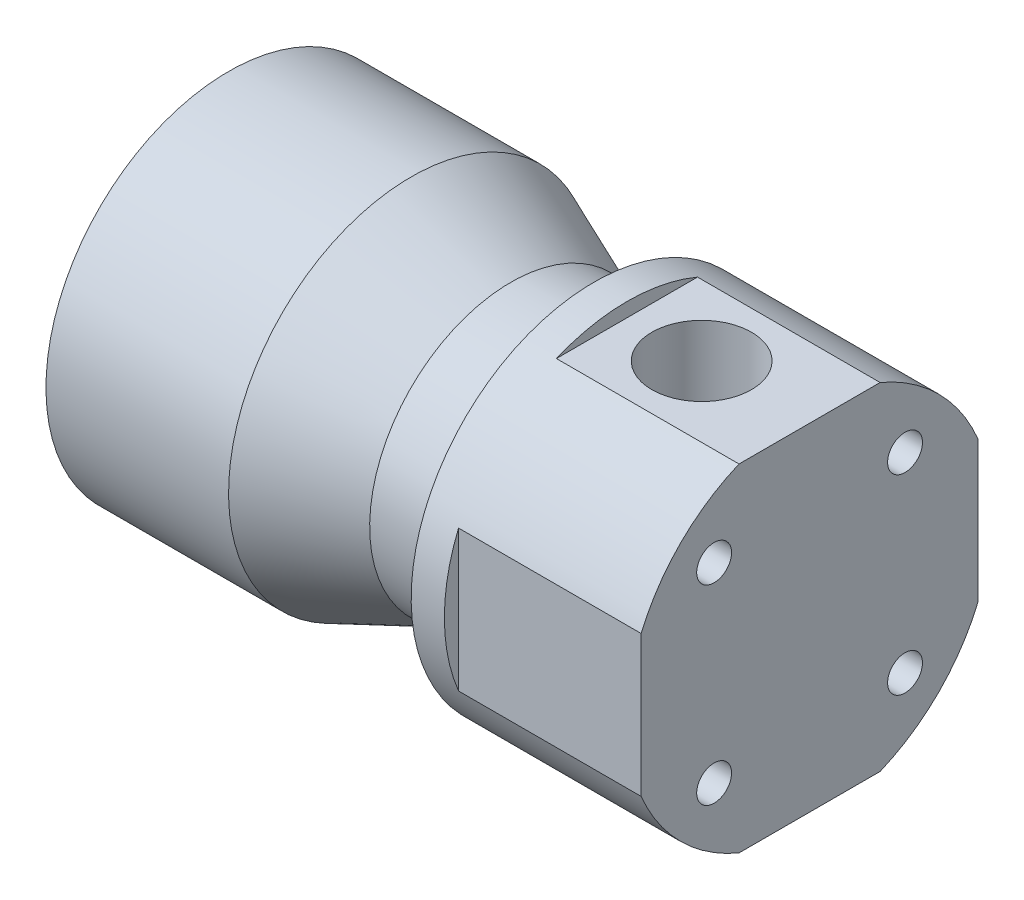
ISO-10303-21;
HEADER;
FILE_DESCRIPTION(('STEP AP214'),'2;1');
FILE_NAME('part.step','',(''),(''),'','','');
FILE_SCHEMA(('AUTOMOTIVE_DESIGN { 1 0 10303 214 1 1 1 1 }'));
ENDSEC;
DATA;
#1=APPLICATION_CONTEXT('core data for automotive mechanical design processes');
#2=APPLICATION_PROTOCOL_DEFINITION('international standard','automotive_design',2000,#1);
#3=PRODUCT_CONTEXT('',#1,'mechanical');
#4=PRODUCT('Part','Part','',(#3));
#5=PRODUCT_RELATED_PRODUCT_CATEGORY('part','',(#4));
#6=PRODUCT_DEFINITION_FORMATION('','',#4);
#7=PRODUCT_DEFINITION_CONTEXT('part definition',#1,'design');
#8=PRODUCT_DEFINITION('design','',#6,#7);
#9=PRODUCT_DEFINITION_SHAPE('','',#8);
#10=(LENGTH_UNIT() NAMED_UNIT(*) SI_UNIT(.MILLI.,.METRE.));
#11=(NAMED_UNIT(*) PLANE_ANGLE_UNIT() SI_UNIT($,.RADIAN.));
#12=(NAMED_UNIT(*) SI_UNIT($,.STERADIAN.) SOLID_ANGLE_UNIT());
#13=UNCERTAINTY_MEASURE_WITH_UNIT(LENGTH_MEASURE(1.E-05),#10,'distance_accuracy_value','');
#14=(GEOMETRIC_REPRESENTATION_CONTEXT(3) GLOBAL_UNCERTAINTY_ASSIGNED_CONTEXT((#13)) GLOBAL_UNIT_ASSIGNED_CONTEXT((#10,
#11,#12)) REPRESENTATION_CONTEXT('',''));
#15=CARTESIAN_POINT('',(0.,0.,0.));
#16=DIRECTION('',(0.,0.,1.));
#17=DIRECTION('',(1.,0.,0.));
#18=AXIS2_PLACEMENT_3D('',#15,#16,#17);
#19=CARTESIAN_POINT('',(0.,0.,0.));
#20=DIRECTION('',(-1.,0.,0.));
#21=DIRECTION('',(0.,-1.,0.));
#22=AXIS2_PLACEMENT_3D('',#19,#20,#21);
#23=PLANE('',#22);
#24=CARTESIAN_POINT('',(0.,11.5,11.5));
#25=DIRECTION('',(1.,0.,0.));
#26=DIRECTION('',(0.,0.,-1.));
#27=AXIS2_PLACEMENT_3D('',#24,#25,#26);
#28=CIRCLE('',#27,2.1);
#29=CARTESIAN_POINT('',(0.,11.5,9.4));
#30=VERTEX_POINT('',#29);
#31=EDGE_CURVE('E192',#30,#30,#28,.T.);
#32=ORIENTED_EDGE('',*,*,#31,.F.);
#33=EDGE_LOOP('',(#32));
#34=FACE_BOUND('',#33,.T.);
#35=CARTESIAN_POINT('',(0.,11.5,-11.5));
#36=DIRECTION('',(1.,0.,0.));
#37=DIRECTION('',(0.,0.,-1.));
#38=AXIS2_PLACEMENT_3D('',#35,#36,#37);
#39=CIRCLE('',#38,2.1);
#40=CARTESIAN_POINT('',(0.,11.5,-13.6));
#41=VERTEX_POINT('',#40);
#42=EDGE_CURVE('E184',#41,#41,#39,.T.);
#43=ORIENTED_EDGE('',*,*,#42,.F.);
#44=EDGE_LOOP('',(#43));
#45=FACE_BOUND('',#44,.T.);
#46=CARTESIAN_POINT('',(0.,-11.5,-11.5));
#47=DIRECTION('',(1.,0.,0.));
#48=DIRECTION('',(0.,0.,-1.));
#49=AXIS2_PLACEMENT_3D('',#46,#47,#48);
#50=CIRCLE('',#49,2.1);
#51=CARTESIAN_POINT('',(0.,-11.5,-13.6));
#52=VERTEX_POINT('',#51);
#53=EDGE_CURVE('E176',#52,#52,#50,.T.);
#54=ORIENTED_EDGE('',*,*,#53,.F.);
#55=EDGE_LOOP('',(#54));
#56=FACE_BOUND('',#55,.T.);
#57=CARTESIAN_POINT('',(0.,-11.5,11.5));
#58=DIRECTION('',(1.,0.,0.));
#59=DIRECTION('',(0.,0.,-1.));
#60=AXIS2_PLACEMENT_3D('',#57,#58,#59);
#61=CIRCLE('',#60,2.1);
#62=CARTESIAN_POINT('',(0.,-11.5,9.4));
#63=VERTEX_POINT('',#62);
#64=EDGE_CURVE('E165',#63,#63,#61,.T.);
#65=ORIENTED_EDGE('',*,*,#64,.F.);
#66=EDGE_LOOP('',(#65));
#67=FACE_BOUND('',#66,.T.);
#68=CARTESIAN_POINT('',(0.,0.,0.));
#69=DIRECTION('',(-1.,0.,0.));
#70=DIRECTION('',(0.,-1.,0.));
#71=AXIS2_PLACEMENT_3D('',#68,#69,#70);
#72=CIRCLE('',#71,22.);
#73=CARTESIAN_POINT('',(0.,8.5,20.291623887703));
#74=VERTEX_POINT('',#73);
#75=CARTESIAN_POINT('',(0.,20.2916238877031,8.49999999999993));
#76=VERTEX_POINT('',#75);
#77=EDGE_CURVE('E53',#74,#76,#72,.T.);
#78=ORIENTED_EDGE('',*,*,#77,.F.);
#79=DIRECTION('',(0.,1.,0.));
#80=VECTOR('',#79,1.);
#81=CARTESIAN_POINT('',(0.,-8.5,20.291623887703));
#82=LINE('',#81,#80);
#83=CARTESIAN_POINT('',(0.,-8.5,20.291623887703));
#84=VERTEX_POINT('',#83);
#85=EDGE_CURVE('E169',#84,#74,#82,.T.);
#86=ORIENTED_EDGE('',*,*,#85,.F.);
#87=CARTESIAN_POINT('',(0.,-20.2916238877029,8.50000000000021));
#88=VERTEX_POINT('',#87);
#89=EDGE_CURVE('E11',#88,#84,#72,.T.);
#90=ORIENTED_EDGE('',*,*,#89,.F.);
#91=DIRECTION('',(0.,0.,1.));
#92=VECTOR('',#91,1.);
#93=CARTESIAN_POINT('',(0.,-20.2916238877031,-8.49999999999979));
#94=LINE('',#93,#92);
#95=CARTESIAN_POINT('',(0.,-20.2916238877031,-8.49999999999979));
#96=VERTEX_POINT('',#95);
#97=EDGE_CURVE('E213',#96,#88,#94,.T.);
#98=ORIENTED_EDGE('',*,*,#97,.F.);
#99=CARTESIAN_POINT('',(0.,-8.50000000000014,-20.291623887703));
#100=VERTEX_POINT('',#99);
#101=EDGE_CURVE('E54',#100,#96,#72,.T.);
#102=ORIENTED_EDGE('',*,*,#101,.F.);
#103=DIRECTION('',(0.,-1.,0.));
#104=VECTOR('',#103,1.);
#105=CARTESIAN_POINT('',(0.,8.49999999999986,-20.2916238877031));
#106=LINE('',#105,#104);
#107=CARTESIAN_POINT('',(0.,8.49999999999986,-20.2916238877031));
#108=VERTEX_POINT('',#107);
#109=EDGE_CURVE('E132',#108,#100,#106,.T.);
#110=ORIENTED_EDGE('',*,*,#109,.F.);
#111=CARTESIAN_POINT('',(0.,20.291623887703,-8.50000000000007));
#112=VERTEX_POINT('',#111);
#113=EDGE_CURVE('E130',#112,#108,#72,.T.);
#114=ORIENTED_EDGE('',*,*,#113,.F.);
#115=DIRECTION('',(0.,0.,-1.));
#116=VECTOR('',#115,1.);
#117=CARTESIAN_POINT('',(0.,20.2916238877031,8.49999999999993));
#118=LINE('',#117,#116);
#119=EDGE_CURVE('E110',#76,#112,#118,.T.);
#120=ORIENTED_EDGE('',*,*,#119,.F.);
#121=EDGE_LOOP('',(#78,#86,#90,#98,#102,#110,#114,#120));
#122=FACE_BOUND('',#121,.T.);
#123=ADVANCED_FACE('F45',(#34,#45,#56,#67,#122),#23,.F.);
#124=CARTESIAN_POINT('',(-70.,0.,0.));
#125=DIRECTION('',(-1.,0.,0.));
#126=DIRECTION('',(0.,-1.,0.));
#127=AXIS2_PLACEMENT_3D('',#124,#125,#126);
#128=CYLINDRICAL_SURFACE('',#127,22.);
#129=ORIENTED_EDGE('',*,*,#89,.T.);
#130=DIRECTION('',(1.,0.,0.));
#131=VECTOR('',#130,1.);
#132=CARTESIAN_POINT('',(-22.,-8.5,20.291623887703));
#133=LINE('',#132,#131);
#134=CARTESIAN_POINT('',(-22.,-8.5,20.291623887703));
#135=VERTEX_POINT('',#134);
#136=EDGE_CURVE('E202',#135,#84,#133,.T.);
#137=ORIENTED_EDGE('',*,*,#136,.F.);
#138=CARTESIAN_POINT('',(-22.,0.,0.));
#139=DIRECTION('',(1.,0.,0.));
#140=DIRECTION('',(0.,0.,-1.));
#141=AXIS2_PLACEMENT_3D('',#138,#139,#140);
#142=CIRCLE('',#141,22.);
#143=CARTESIAN_POINT('',(-22.,8.5,20.291623887703));
#144=VERTEX_POINT('',#143);
#145=EDGE_CURVE('E197',#144,#135,#142,.T.);
#146=ORIENTED_EDGE('',*,*,#145,.F.);
#147=DIRECTION('',(1.,0.,0.));
#148=VECTOR('',#147,1.);
#149=CARTESIAN_POINT('',(-22.,8.5,20.291623887703));
#150=LINE('',#149,#148);
#151=EDGE_CURVE('E196',#144,#74,#150,.T.);
#152=ORIENTED_EDGE('',*,*,#151,.T.);
#153=ORIENTED_EDGE('',*,*,#77,.T.);
#154=DIRECTION('',(1.,0.,0.));
#155=VECTOR('',#154,1.);
#156=CARTESIAN_POINT('',(-22.,20.2916238877031,8.49999999999993));
#157=LINE('',#156,#155);
#158=CARTESIAN_POINT('',(-22.,20.2916238877031,8.49999999999993));
#159=VERTEX_POINT('',#158);
#160=EDGE_CURVE('E116',#159,#76,#157,.T.);
#161=ORIENTED_EDGE('',*,*,#160,.F.);
#162=CARTESIAN_POINT('',(-22.,0.,0.));
#163=DIRECTION('',(1.,0.,0.));
#164=DIRECTION('',(0.,0.,-1.));
#165=AXIS2_PLACEMENT_3D('',#162,#163,#164);
#166=CIRCLE('',#165,22.);
#167=CARTESIAN_POINT('',(-22.,20.291623887703,-8.50000000000007));
#168=VERTEX_POINT('',#167);
#169=EDGE_CURVE('E123',#168,#159,#166,.T.);
#170=ORIENTED_EDGE('',*,*,#169,.F.);
#171=DIRECTION('',(1.,0.,0.));
#172=VECTOR('',#171,1.);
#173=CARTESIAN_POINT('',(-22.,20.291623887703,-8.50000000000007));
#174=LINE('',#173,#172);
#175=EDGE_CURVE('E113',#168,#112,#174,.T.);
#176=ORIENTED_EDGE('',*,*,#175,.T.);
#177=ORIENTED_EDGE('',*,*,#113,.T.);
#178=DIRECTION('',(1.,0.,0.));
#179=VECTOR('',#178,1.);
#180=CARTESIAN_POINT('',(-22.,8.49999999999986,-20.2916238877031));
#181=LINE('',#180,#179);
#182=CARTESIAN_POINT('',(-22.,8.49999999999986,-20.2916238877031));
#183=VERTEX_POINT('',#182);
#184=EDGE_CURVE('E234',#183,#108,#181,.T.);
#185=ORIENTED_EDGE('',*,*,#184,.F.);
#186=CARTESIAN_POINT('',(-22.,0.,0.));
#187=DIRECTION('',(1.,0.,0.));
#188=DIRECTION('',(0.,0.,-1.));
#189=AXIS2_PLACEMENT_3D('',#186,#187,#188);
#190=CIRCLE('',#189,22.);
#191=CARTESIAN_POINT('',(-22.,-8.50000000000014,-20.291623887703));
#192=VERTEX_POINT('',#191);
#193=EDGE_CURVE('E228',#192,#183,#190,.T.);
#194=ORIENTED_EDGE('',*,*,#193,.F.);
#195=DIRECTION('',(1.,0.,0.));
#196=VECTOR('',#195,1.);
#197=CARTESIAN_POINT('',(-22.,-8.50000000000014,-20.291623887703));
#198=LINE('',#197,#196);
#199=EDGE_CURVE('E220',#192,#100,#198,.T.);
#200=ORIENTED_EDGE('',*,*,#199,.T.);
#201=ORIENTED_EDGE('',*,*,#101,.T.);
#202=DIRECTION('',(1.,0.,0.));
#203=VECTOR('',#202,1.);
#204=CARTESIAN_POINT('',(-22.,-20.2916238877031,-8.49999999999979));
#205=LINE('',#204,#203);
#206=CARTESIAN_POINT('',(-22.,-20.2916238877031,-8.49999999999979));
#207=VERTEX_POINT('',#206);
#208=EDGE_CURVE('E217',#207,#96,#205,.T.);
#209=ORIENTED_EDGE('',*,*,#208,.F.);
#210=CARTESIAN_POINT('',(-22.,0.,0.));
#211=DIRECTION('',(1.,0.,0.));
#212=DIRECTION('',(0.,0.,-1.));
#213=AXIS2_PLACEMENT_3D('',#210,#211,#212);
#214=CIRCLE('',#213,22.);
#215=CARTESIAN_POINT('',(-22.,-20.2916238877029,8.50000000000021));
#216=VERTEX_POINT('',#215);
#217=EDGE_CURVE('E210',#216,#207,#214,.T.);
#218=ORIENTED_EDGE('',*,*,#217,.F.);
#219=DIRECTION('',(1.,0.,0.));
#220=VECTOR('',#219,1.);
#221=CARTESIAN_POINT('',(-22.,-20.2916238877029,8.50000000000021));
#222=LINE('',#221,#220);
#223=EDGE_CURVE('E221',#216,#88,#222,.T.);
#224=ORIENTED_EDGE('',*,*,#223,.T.);
#225=EDGE_LOOP('',(#129,#137,#146,#152,#153,#161,#170,#176,#177,#185,#194,#200,#201,#209,#218,#224));
#226=FACE_BOUND('',#225,.T.);
#227=CARTESIAN_POINT('',(-26.,0.,0.));
#228=DIRECTION('',(-1.,0.,0.));
#229=DIRECTION('',(0.,-1.,0.));
#230=AXIS2_PLACEMENT_3D('',#227,#228,#229);
#231=CIRCLE('',#230,22.);
#232=CARTESIAN_POINT('',(-26.,-22.,0.));
#233=VERTEX_POINT('',#232);
#234=EDGE_CURVE('E140',#233,#233,#231,.T.);
#235=ORIENTED_EDGE('',*,*,#234,.F.);
#236=EDGE_LOOP('',(#235));
#237=FACE_BOUND('',#236,.T.);
#238=ADVANCED_FACE('F127',(#226,#237),#128,.T.);
#239=CARTESIAN_POINT('',(-26.,22.,0.));
#240=DIRECTION('',(1.,0.,0.));
#241=DIRECTION('',(0.,1.,0.));
#242=AXIS2_PLACEMENT_3D('',#239,#240,#241);
#243=PLANE('',#242);
#244=CARTESIAN_POINT('',(-26.,0.,0.));
#245=DIRECTION('',(-1.,0.,0.));
#246=DIRECTION('',(0.,-1.,0.));
#247=AXIS2_PLACEMENT_3D('',#244,#245,#246);
#248=CIRCLE('',#247,17.);
#249=CARTESIAN_POINT('',(-26.,-17.,0.));
#250=VERTEX_POINT('',#249);
#251=EDGE_CURVE('E145',#250,#250,#248,.T.);
#252=ORIENTED_EDGE('',*,*,#251,.F.);
#253=EDGE_LOOP('',(#252));
#254=FACE_BOUND('',#253,.T.);
#255=ORIENTED_EDGE('',*,*,#234,.T.);
#256=EDGE_LOOP('',(#255));
#257=FACE_BOUND('',#256,.T.);
#258=ADVANCED_FACE('F280',(#254,#257),#243,.F.);
#259=CARTESIAN_POINT('',(-70.,0.,0.));
#260=DIRECTION('',(-1.,0.,0.));
#261=DIRECTION('',(0.,-1.,0.));
#262=AXIS2_PLACEMENT_3D('',#259,#260,#261);
#263=CYLINDRICAL_SURFACE('',#262,17.);
#264=CARTESIAN_POINT('',(-36.,0.,0.));
#265=DIRECTION('',(-1.,0.,0.));
#266=DIRECTION('',(0.,-1.,0.));
#267=AXIS2_PLACEMENT_3D('',#264,#265,#266);
#268=CIRCLE('',#267,17.);
#269=CARTESIAN_POINT('',(-36.,-17.,0.));
#270=VERTEX_POINT('',#269);
#271=EDGE_CURVE('E150',#270,#270,#268,.T.);
#272=ORIENTED_EDGE('',*,*,#271,.F.);
#273=EDGE_LOOP('',(#272));
#274=FACE_BOUND('',#273,.T.);
#275=ORIENTED_EDGE('',*,*,#251,.T.);
#276=EDGE_LOOP('',(#275));
#277=FACE_BOUND('',#276,.T.);
#278=ADVANCED_FACE('F317',(#274,#277),#263,.T.);
#279=CARTESIAN_POINT('',(-36.,0.,0.));
#280=DIRECTION('',(-1.,0.,0.));
#281=DIRECTION('',(0.,-1.,0.));
#282=AXIS2_PLACEMENT_3D('',#279,#280,#281);
#283=CONICAL_SURFACE('',#282,17.,0.394791119699761);
#284=CARTESIAN_POINT('',(-48.,0.,0.));
#285=DIRECTION('',(-1.,0.,0.));
#286=DIRECTION('',(0.,-1.,0.));
#287=AXIS2_PLACEMENT_3D('',#284,#285,#286);
#288=CIRCLE('',#287,22.);
#289=CARTESIAN_POINT('',(-48.,-22.,0.));
#290=VERTEX_POINT('',#289);
#291=EDGE_CURVE('E156',#290,#290,#288,.T.);
#292=ORIENTED_EDGE('',*,*,#291,.F.);
#293=EDGE_LOOP('',(#292));
#294=FACE_BOUND('',#293,.T.);
#295=ORIENTED_EDGE('',*,*,#271,.T.);
#296=EDGE_LOOP('',(#295));
#297=FACE_BOUND('',#296,.T.);
#298=ADVANCED_FACE('F313',(#294,#297),#283,.T.);
#299=CARTESIAN_POINT('',(-70.,0.,0.));
#300=DIRECTION('',(-1.,0.,0.));
#301=DIRECTION('',(0.,-1.,0.));
#302=AXIS2_PLACEMENT_3D('',#299,#300,#301);
#303=CYLINDRICAL_SURFACE('',#302,22.);
#304=CARTESIAN_POINT('',(-70.,0.,0.));
#305=DIRECTION('',(-1.,0.,0.));
#306=DIRECTION('',(0.,-1.,0.));
#307=AXIS2_PLACEMENT_3D('',#304,#305,#306);
#308=CIRCLE('',#307,22.);
#309=CARTESIAN_POINT('',(-70.,-22.,0.));
#310=VERTEX_POINT('',#309);
#311=EDGE_CURVE('E160',#310,#310,#308,.T.);
#312=ORIENTED_EDGE('',*,*,#311,.F.);
#313=EDGE_LOOP('',(#312));
#314=FACE_BOUND('',#313,.T.);
#315=ORIENTED_EDGE('',*,*,#291,.T.);
#316=EDGE_LOOP('',(#315));
#317=FACE_BOUND('',#316,.T.);
#318=ADVANCED_FACE('F309',(#314,#317),#303,.T.);
#319=CARTESIAN_POINT('',(-70.,22.,0.));
#320=DIRECTION('',(1.,0.,0.));
#321=DIRECTION('',(0.,1.,0.));
#322=AXIS2_PLACEMENT_3D('',#319,#320,#321);
#323=PLANE('',#322);
#324=ORIENTED_EDGE('',*,*,#311,.T.);
#325=EDGE_LOOP('',(#324));
#326=FACE_BOUND('',#325,.T.);
#327=ADVANCED_FACE('F306',(#326),#323,.F.);
#328=CARTESIAN_POINT('',(-22.,-20.2916238877031,-8.49999999999979));
#329=DIRECTION('',(0.,1.,0.));
#330=DIRECTION('',(0.,0.,1.));
#331=AXIS2_PLACEMENT_3D('',#328,#329,#330);
#332=PLANE('',#331);
#333=CARTESIAN_POINT('',(-13.,-20.291623887703,0.));
#334=DIRECTION('',(0.,1.,0.));
#335=DIRECTION('',(0.,0.,1.));
#336=AXIS2_PLACEMENT_3D('',#333,#334,#335);
#337=CIRCLE('',#336,6.);
#338=CARTESIAN_POINT('',(-13.,-20.291623887703,6.00000000000008));
#339=VERTEX_POINT('',#338);
#340=EDGE_CURVE('E225',#339,#339,#337,.F.);
#341=ORIENTED_EDGE('',*,*,#340,.F.);
#342=EDGE_LOOP('',(#341));
#343=FACE_BOUND('',#342,.T.);
#344=ORIENTED_EDGE('',*,*,#97,.T.);
#345=ORIENTED_EDGE('',*,*,#223,.F.);
#346=DIRECTION('',(0.,0.,1.));
#347=VECTOR('',#346,1.);
#348=CARTESIAN_POINT('',(-22.,-20.2916238877031,-8.49999999999979));
#349=LINE('',#348,#347);
#350=EDGE_CURVE('E214',#207,#216,#349,.T.);
#351=ORIENTED_EDGE('',*,*,#350,.F.);
#352=ORIENTED_EDGE('',*,*,#208,.T.);
#353=EDGE_LOOP('',(#344,#345,#351,#352));
#354=FACE_BOUND('',#353,.T.);
#355=ADVANCED_FACE('F308',(#343,#354),#332,.F.);
#356=CARTESIAN_POINT('',(-22.,0.,0.));
#357=DIRECTION('',(1.,0.,0.));
#358=DIRECTION('',(0.,0.,-1.));
#359=AXIS2_PLACEMENT_3D('',#356,#357,#358);
#360=PLANE('',#359);
#361=ORIENTED_EDGE('',*,*,#217,.T.);
#362=ORIENTED_EDGE('',*,*,#350,.T.);
#363=EDGE_LOOP('',(#361,#362));
#364=FACE_BOUND('',#363,.T.);
#365=ADVANCED_FACE('F358',(#364),#360,.T.);
#366=CARTESIAN_POINT('',(-22.,8.49999999999986,-20.2916238877031));
#367=DIRECTION('',(0.,0.,1.));
#368=DIRECTION('',(0.,-1.,0.));
#369=AXIS2_PLACEMENT_3D('',#366,#367,#368);
#370=PLANE('',#369);
#371=ORIENTED_EDGE('',*,*,#109,.T.);
#372=ORIENTED_EDGE('',*,*,#199,.F.);
#373=DIRECTION('',(0.,-1.,0.));
#374=VECTOR('',#373,1.);
#375=CARTESIAN_POINT('',(-22.,8.49999999999986,-20.2916238877031));
#376=LINE('',#375,#374);
#377=EDGE_CURVE('E231',#183,#192,#376,.T.);
#378=ORIENTED_EDGE('',*,*,#377,.F.);
#379=ORIENTED_EDGE('',*,*,#184,.T.);
#380=EDGE_LOOP('',(#371,#372,#378,#379));
#381=FACE_BOUND('',#380,.T.);
#382=ADVANCED_FACE('F270',(#381),#370,.F.);
#383=CARTESIAN_POINT('',(-22.,0.,0.));
#384=DIRECTION('',(1.,0.,0.));
#385=DIRECTION('',(0.,0.,-1.));
#386=AXIS2_PLACEMENT_3D('',#383,#384,#385);
#387=PLANE('',#386);
#388=ORIENTED_EDGE('',*,*,#193,.T.);
#389=ORIENTED_EDGE('',*,*,#377,.T.);
#390=EDGE_LOOP('',(#388,#389));
#391=FACE_BOUND('',#390,.T.);
#392=ADVANCED_FACE('F260',(#391),#387,.T.);
#393=CARTESIAN_POINT('',(-22.,20.2916238877031,8.49999999999993));
#394=DIRECTION('',(0.,-1.,0.));
#395=DIRECTION('',(0.,0.,-1.));
#396=AXIS2_PLACEMENT_3D('',#393,#394,#395);
#397=PLANE('',#396);
#398=CARTESIAN_POINT('',(-13.,20.291623887703,0.));
#399=DIRECTION('',(0.,1.,0.));
#400=DIRECTION('',(0.,0.,1.));
#401=AXIS2_PLACEMENT_3D('',#398,#399,#400);
#402=CIRCLE('',#401,6.);
#403=CARTESIAN_POINT('',(-13.,20.2916238877031,5.99999999999993));
#404=VERTEX_POINT('',#403);
#405=EDGE_CURVE('E250',#404,#404,#402,.T.);
#406=ORIENTED_EDGE('',*,*,#405,.F.);
#407=EDGE_LOOP('',(#406));
#408=FACE_BOUND('',#407,.T.);
#409=ORIENTED_EDGE('',*,*,#119,.T.);
#410=ORIENTED_EDGE('',*,*,#175,.F.);
#411=DIRECTION('',(0.,0.,-1.));
#412=VECTOR('',#411,1.);
#413=CARTESIAN_POINT('',(-22.,20.2916238877031,8.49999999999993));
#414=LINE('',#413,#412);
#415=EDGE_CURVE('E67',#159,#168,#414,.T.);
#416=ORIENTED_EDGE('',*,*,#415,.F.);
#417=ORIENTED_EDGE('',*,*,#160,.T.);
#418=EDGE_LOOP('',(#409,#410,#416,#417));
#419=FACE_BOUND('',#418,.T.);
#420=ADVANCED_FACE('F112',(#408,#419),#397,.F.);
#421=CARTESIAN_POINT('',(-22.,0.,0.));
#422=DIRECTION('',(1.,0.,0.));
#423=DIRECTION('',(0.,0.,-1.));
#424=AXIS2_PLACEMENT_3D('',#421,#422,#423);
#425=PLANE('',#424);
#426=ORIENTED_EDGE('',*,*,#169,.T.);
#427=ORIENTED_EDGE('',*,*,#415,.T.);
#428=EDGE_LOOP('',(#426,#427));
#429=FACE_BOUND('',#428,.T.);
#430=ADVANCED_FACE('F259',(#429),#425,.T.);
#431=CARTESIAN_POINT('',(-22.,-8.5,20.291623887703));
#432=DIRECTION('',(0.,0.,-1.));
#433=DIRECTION('',(-1.,0.,0.));
#434=AXIS2_PLACEMENT_3D('',#431,#432,#433);
#435=PLANE('',#434);
#436=ORIENTED_EDGE('',*,*,#85,.T.);
#437=ORIENTED_EDGE('',*,*,#151,.F.);
#438=DIRECTION('',(0.,1.,0.));
#439=VECTOR('',#438,1.);
#440=CARTESIAN_POINT('',(-22.,-8.5,20.291623887703));
#441=LINE('',#440,#439);
#442=EDGE_CURVE('E60',#135,#144,#441,.T.);
#443=ORIENTED_EDGE('',*,*,#442,.F.);
#444=ORIENTED_EDGE('',*,*,#136,.T.);
#445=EDGE_LOOP('',(#436,#437,#443,#444));
#446=FACE_BOUND('',#445,.T.);
#447=ADVANCED_FACE('F267',(#446),#435,.F.);
#448=CARTESIAN_POINT('',(-22.,0.,0.));
#449=DIRECTION('',(1.,0.,0.));
#450=DIRECTION('',(0.,0.,-1.));
#451=AXIS2_PLACEMENT_3D('',#448,#449,#450);
#452=PLANE('',#451);
#453=ORIENTED_EDGE('',*,*,#145,.T.);
#454=ORIENTED_EDGE('',*,*,#442,.T.);
#455=EDGE_LOOP('',(#453,#454));
#456=FACE_BOUND('',#455,.T.);
#457=ADVANCED_FACE('F292',(#456),#452,.T.);
#458=CARTESIAN_POINT('',(-22.,-11.5,11.5));
#459=DIRECTION('',(1.,0.,0.));
#460=DIRECTION('',(0.,0.,-1.));
#461=AXIS2_PLACEMENT_3D('',#458,#459,#460);
#462=CYLINDRICAL_SURFACE('',#461,2.1);
#463=CARTESIAN_POINT('',(-22.,-11.5,11.5));
#464=DIRECTION('',(1.,0.,0.));
#465=DIRECTION('',(0.,0.,-1.));
#466=AXIS2_PLACEMENT_3D('',#463,#464,#465);
#467=CIRCLE('',#466,2.1);
#468=CARTESIAN_POINT('',(-22.,-11.5,9.4));
#469=VERTEX_POINT('',#468);
#470=EDGE_CURVE('E164',#469,#469,#467,.T.);
#471=ORIENTED_EDGE('',*,*,#470,.F.);
#472=EDGE_LOOP('',(#471));
#473=FACE_BOUND('',#472,.T.);
#474=ORIENTED_EDGE('',*,*,#64,.T.);
#475=EDGE_LOOP('',(#474));
#476=FACE_BOUND('',#475,.T.);
#477=ADVANCED_FACE('F289',(#473,#476),#462,.F.);
#478=CARTESIAN_POINT('',(-22.,-11.5,11.5));
#479=DIRECTION('',(1.,0.,0.));
#480=DIRECTION('',(0.,0.,-1.));
#481=AXIS2_PLACEMENT_3D('',#478,#479,#480);
#482=PLANE('',#481);
#483=ORIENTED_EDGE('',*,*,#470,.T.);
#484=EDGE_LOOP('',(#483));
#485=FACE_BOUND('',#484,.T.);
#486=ADVANCED_FACE('F291',(#485),#482,.T.);
#487=CARTESIAN_POINT('',(-22.,-11.5,-11.5));
#488=DIRECTION('',(1.,0.,0.));
#489=DIRECTION('',(0.,0.,-1.));
#490=AXIS2_PLACEMENT_3D('',#487,#488,#489);
#491=CYLINDRICAL_SURFACE('',#490,2.1);
#492=CARTESIAN_POINT('',(-22.,-11.5,-11.5));
#493=DIRECTION('',(1.,0.,0.));
#494=DIRECTION('',(0.,0.,-1.));
#495=AXIS2_PLACEMENT_3D('',#492,#493,#494);
#496=CIRCLE('',#495,2.1);
#497=CARTESIAN_POINT('',(-22.,-11.5,-13.6));
#498=VERTEX_POINT('',#497);
#499=EDGE_CURVE('E122',#498,#498,#496,.T.);
#500=ORIENTED_EDGE('',*,*,#499,.F.);
#501=EDGE_LOOP('',(#500));
#502=FACE_BOUND('',#501,.T.);
#503=ORIENTED_EDGE('',*,*,#53,.T.);
#504=EDGE_LOOP('',(#503));
#505=FACE_BOUND('',#504,.T.);
#506=ADVANCED_FACE('F299',(#502,#505),#491,.F.);
#507=CARTESIAN_POINT('',(-22.,-11.5,-11.5));
#508=DIRECTION('',(1.,0.,0.));
#509=DIRECTION('',(0.,0.,-1.));
#510=AXIS2_PLACEMENT_3D('',#507,#508,#509);
#511=PLANE('',#510);
#512=ORIENTED_EDGE('',*,*,#499,.T.);
#513=EDGE_LOOP('',(#512));
#514=FACE_BOUND('',#513,.T.);
#515=ADVANCED_FACE('F428',(#514),#511,.T.);
#516=CARTESIAN_POINT('',(-22.,11.5,-11.5));
#517=DIRECTION('',(1.,0.,0.));
#518=DIRECTION('',(0.,0.,-1.));
#519=AXIS2_PLACEMENT_3D('',#516,#517,#518);
#520=CYLINDRICAL_SURFACE('',#519,2.1);
#521=CARTESIAN_POINT('',(-22.,11.5,-11.5));
#522=DIRECTION('',(1.,0.,0.));
#523=DIRECTION('',(0.,0.,-1.));
#524=AXIS2_PLACEMENT_3D('',#521,#522,#523);
#525=CIRCLE('',#524,2.1);
#526=CARTESIAN_POINT('',(-22.,11.5,-13.6));
#527=VERTEX_POINT('',#526);
#528=EDGE_CURVE('E180',#527,#527,#525,.T.);
#529=ORIENTED_EDGE('',*,*,#528,.F.);
#530=EDGE_LOOP('',(#529));
#531=FACE_BOUND('',#530,.T.);
#532=ORIENTED_EDGE('',*,*,#42,.T.);
#533=EDGE_LOOP('',(#532));
#534=FACE_BOUND('',#533,.T.);
#535=ADVANCED_FACE('F438',(#531,#534),#520,.F.);
#536=CARTESIAN_POINT('',(-22.,11.5,-11.5));
#537=DIRECTION('',(1.,0.,0.));
#538=DIRECTION('',(0.,0.,-1.));
#539=AXIS2_PLACEMENT_3D('',#536,#537,#538);
#540=PLANE('',#539);
#541=ORIENTED_EDGE('',*,*,#528,.T.);
#542=EDGE_LOOP('',(#541));
#543=FACE_BOUND('',#542,.T.);
#544=ADVANCED_FACE('F447',(#543),#540,.T.);
#545=CARTESIAN_POINT('',(-22.,11.5,11.5));
#546=DIRECTION('',(1.,0.,0.));
#547=DIRECTION('',(0.,0.,-1.));
#548=AXIS2_PLACEMENT_3D('',#545,#546,#547);
#549=CYLINDRICAL_SURFACE('',#548,2.1);
#550=CARTESIAN_POINT('',(-22.,11.5,11.5));
#551=DIRECTION('',(1.,0.,0.));
#552=DIRECTION('',(0.,0.,-1.));
#553=AXIS2_PLACEMENT_3D('',#550,#551,#552);
#554=CIRCLE('',#553,2.1);
#555=CARTESIAN_POINT('',(-22.,11.5,9.4));
#556=VERTEX_POINT('',#555);
#557=EDGE_CURVE('E188',#556,#556,#554,.T.);
#558=ORIENTED_EDGE('',*,*,#557,.F.);
#559=EDGE_LOOP('',(#558));
#560=FACE_BOUND('',#559,.T.);
#561=ORIENTED_EDGE('',*,*,#31,.T.);
#562=EDGE_LOOP('',(#561));
#563=FACE_BOUND('',#562,.T.);
#564=ADVANCED_FACE('F457',(#560,#563),#549,.F.);
#565=CARTESIAN_POINT('',(-22.,11.5,11.5));
#566=DIRECTION('',(1.,0.,0.));
#567=DIRECTION('',(0.,0.,-1.));
#568=AXIS2_PLACEMENT_3D('',#565,#566,#567);
#569=PLANE('',#568);
#570=ORIENTED_EDGE('',*,*,#557,.T.);
#571=EDGE_LOOP('',(#570));
#572=FACE_BOUND('',#571,.T.);
#573=ADVANCED_FACE('F467',(#572),#569,.T.);
#574=CARTESIAN_POINT('',(-13.,-22.0010000000001,0.));
#575=DIRECTION('',(0.,1.,0.));
#576=DIRECTION('',(0.,0.,1.));
#577=AXIS2_PLACEMENT_3D('',#574,#575,#576);
#578=CYLINDRICAL_SURFACE('',#577,6.);
#579=CARTESIAN_POINT('',(-13.,20.2916238877031,5.99999999999993));
#580=CARTESIAN_POINT('',(-13.,19.8688817233759,5.99999999999993));
#581=CARTESIAN_POINT('',(-13.,19.4461395590488,5.99999999999993));
#582=CARTESIAN_POINT('',(-13.,18.6006552303945,5.99999999999993));
#583=CARTESIAN_POINT('',(-13.,18.1779130660673,5.99999999999993));
#584=CARTESIAN_POINT('',(-13.,17.332428737413,5.99999999999994));
#585=CARTESIAN_POINT('',(-13.,16.9096865730859,5.99999999999994));
#586=CARTESIAN_POINT('',(-13.,16.0642022444316,5.99999999999994));
#587=CARTESIAN_POINT('',(-13.,15.6414600801044,5.99999999999994));
#588=CARTESIAN_POINT('',(-13.,14.7959757514502,5.99999999999995));
#589=CARTESIAN_POINT('',(-13.,14.373233587123,5.99999999999995));
#590=CARTESIAN_POINT('',(-13.,13.5277492584687,5.99999999999995));
#591=CARTESIAN_POINT('',(-13.,13.1050070941416,5.99999999999995));
#592=CARTESIAN_POINT('',(-13.,12.2595227654873,5.99999999999996));
#593=CARTESIAN_POINT('',(-13.,11.8367806011601,5.99999999999996));
#594=CARTESIAN_POINT('',(-13.,10.9912962725058,5.99999999999996));
#595=CARTESIAN_POINT('',(-13.,10.5685541081787,5.99999999999996));
#596=CARTESIAN_POINT('',(-13.,9.7230697795244,5.99999999999997));
#597=CARTESIAN_POINT('',(-13.,9.30032761519726,5.99999999999997));
#598=CARTESIAN_POINT('',(-13.,8.45484328654297,5.99999999999997));
#599=CARTESIAN_POINT('',(-13.,8.03210112221582,5.99999999999997));
#600=CARTESIAN_POINT('',(-13.,7.18661679356153,5.99999999999998));
#601=CARTESIAN_POINT('',(-13.,6.76387462923438,5.99999999999998));
#602=CARTESIAN_POINT('',(-13.,5.91839030058009,5.99999999999998));
#603=CARTESIAN_POINT('',(-13.,5.49564813625295,5.99999999999998));
#604=CARTESIAN_POINT('',(-13.,4.65016380759865,5.99999999999998));
#605=CARTESIAN_POINT('',(-13.,4.22742164327151,5.99999999999999));
#606=CARTESIAN_POINT('',(-13.,3.38193731461721,5.99999999999999));
#607=CARTESIAN_POINT('',(-13.,2.95919515029007,5.99999999999999));
#608=CARTESIAN_POINT('',(-13.,2.11371082163577,5.99999999999999));
#609=CARTESIAN_POINT('',(-13.,1.69096865730863,5.99999999999999));
#610=CARTESIAN_POINT('',(-13.,0.845484328654337,6.));
#611=CARTESIAN_POINT('',(-13.,0.422742164327191,6.));
#612=CARTESIAN_POINT('',(-13.,-0.422742164327101,6.));
#613=CARTESIAN_POINT('',(-13.,-0.845484328654247,6.));
#614=CARTESIAN_POINT('',(-13.,-1.69096865730854,6.00000000000001));
#615=CARTESIAN_POINT('',(-13.,-2.11371082163568,6.00000000000001));
#616=CARTESIAN_POINT('',(-13.,-2.95919515028998,6.00000000000001));
#617=CARTESIAN_POINT('',(-13.,-3.38193731461712,6.00000000000001));
#618=CARTESIAN_POINT('',(-13.,-4.22742164327142,6.00000000000002));
#619=CARTESIAN_POINT('',(-13.,-4.65016380759856,6.00000000000002));
#620=CARTESIAN_POINT('',(-13.,-5.49564813625286,6.00000000000002));
#621=CARTESIAN_POINT('',(-13.,-5.91839030058,6.00000000000002));
#622=CARTESIAN_POINT('',(-13.,-6.76387462923429,6.00000000000003));
#623=CARTESIAN_POINT('',(-13.,-7.18661679356144,6.00000000000003));
#624=CARTESIAN_POINT('',(-13.,-8.03210112221573,6.00000000000003));
#625=CARTESIAN_POINT('',(-13.,-8.45484328654288,6.00000000000003));
#626=CARTESIAN_POINT('',(-13.,-9.30032761519717,6.00000000000003));
#627=CARTESIAN_POINT('',(-13.,-9.72306977952431,6.00000000000004));
#628=CARTESIAN_POINT('',(-13.,-10.5685541081786,6.00000000000004));
#629=CARTESIAN_POINT('',(-13.,-10.9912962725057,6.00000000000004));
#630=CARTESIAN_POINT('',(-13.,-11.83678060116,6.00000000000004));
#631=CARTESIAN_POINT('',(-13.,-12.2595227654872,6.00000000000005));
#632=CARTESIAN_POINT('',(-13.,-13.1050070941415,6.00000000000005));
#633=CARTESIAN_POINT('',(-13.,-13.5277492584686,6.00000000000005));
#634=CARTESIAN_POINT('',(-13.,-14.3732335871229,6.00000000000005));
#635=CARTESIAN_POINT('',(-13.,-14.7959757514501,6.00000000000006));
#636=CARTESIAN_POINT('',(-13.,-15.6414600801044,6.00000000000006));
#637=CARTESIAN_POINT('',(-13.,-16.0642022444315,6.00000000000006));
#638=CARTESIAN_POINT('',(-13.,-16.9096865730858,6.00000000000006));
#639=CARTESIAN_POINT('',(-13.,-17.3324287374129,6.00000000000006));
#640=CARTESIAN_POINT('',(-13.,-18.1779130660672,6.00000000000007));
#641=CARTESIAN_POINT('',(-13.,-18.6006552303944,6.00000000000007));
#642=CARTESIAN_POINT('',(-13.,-19.4461395590487,6.00000000000007));
#643=CARTESIAN_POINT('',(-13.,-19.8688817233758,6.00000000000007));
#644=CARTESIAN_POINT('',(-13.,-20.291623887703,6.00000000000008));
#645=B_SPLINE_CURVE_WITH_KNOTS('',3,(#579,#580,#581,#582,#583,#584,#585,#586,#587,#588,#589,
#590,#591,#592,#593,#594,#595,#596,#597,#598,#599,#600,#601,#602,#603,#604,#605,#606,#607,#608,
#609,#610,#611,#612,#613,#614,#615,#616,#617,#618,#619,#620,#621,#622,#623,#624,#625,#626,#627,
#628,#629,#630,#631,#632,#633,#634,#635,#636,#637,#638,#639,#640,#641,#642,#643,#644),
.UNSPECIFIED.,.F.,.F.,(4,2,2,2,2,2,2,2,2,2,2,2,2,2,2,2,2,2,2,2,2,2,2,2,2,2,2,2,2,2,2,2,4),(0.,
1.26822649298144,2.53645298596288,3.80467947894431,5.07290597192575,6.3411324649072,
7.60935895788863,8.87758545087007,10.1458119438515,11.4140384368329,12.6822649298144,
13.9504914227958,15.2187179157773,16.4869444087587,17.7551709017401,19.0233973947216,
20.291623887703,21.5598503806844,22.8280768736659,24.0963033666473,25.3645298596288,
26.6327563526102,27.9009828455916,29.1692093385731,30.4374358315545,31.705662324536,
32.9738888175174,34.2421153104988,35.5103418034803,36.7785682964617,38.0467947894431,
39.3150212824246,40.583247775406),.UNSPECIFIED.);
#646=EDGE_CURVE('BSEAM255',#404,#339,#645,.T.);
#647=ORIENTED_EDGE('',*,*,#405,.T.);
#648=ORIENTED_EDGE('',*,*,#340,.T.);
#649=ORIENTED_EDGE('',*,*,#646,.T.);
#650=ORIENTED_EDGE('',*,*,#646,.F.);
#651=EDGE_LOOP('',(#647,#649,#648,#650));
#652=FACE_BOUND('',#651,.T.);
#653=ADVANCED_FACE('F255',(#652),#578,.F.);
#654=CLOSED_SHELL('',(#123,#238,#258,#278,#298,#318,#327,#355,#365,#382,#392,#420,#430,#447,
#457,#477,#486,#506,#515,#535,#544,#564,#573,#653));
#655=MANIFOLD_SOLID_BREP('B2',#654);
#656=ADVANCED_BREP_SHAPE_REPRESENTATION('',(#18,#655),#14);
#657=SHAPE_DEFINITION_REPRESENTATION(#9,#656);
ENDSEC;
END-ISO-10303-21;
